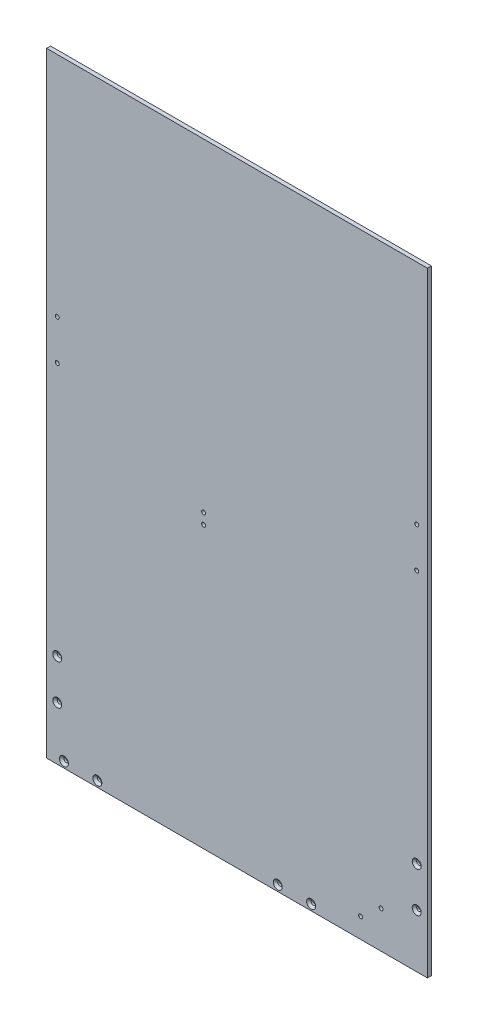
ISO-10303-21;
HEADER;
FILE_DESCRIPTION(('STEP AP214'),'2;1');
FILE_NAME('part.step','',(''),(''),'','','');
FILE_SCHEMA(('AUTOMOTIVE_DESIGN { 1 0 10303 214 1 1 1 1 }'));
ENDSEC;
DATA;
#1=APPLICATION_CONTEXT('core data for automotive mechanical design processes');
#2=APPLICATION_PROTOCOL_DEFINITION('international standard','automotive_design',2000,#1);
#3=PRODUCT_CONTEXT('',#1,'mechanical');
#4=PRODUCT('Part','Part','',(#3));
#5=PRODUCT_RELATED_PRODUCT_CATEGORY('part','',(#4));
#6=PRODUCT_DEFINITION_FORMATION('','',#4);
#7=PRODUCT_DEFINITION_CONTEXT('part definition',#1,'design');
#8=PRODUCT_DEFINITION('design','',#6,#7);
#9=PRODUCT_DEFINITION_SHAPE('','',#8);
#10=(LENGTH_UNIT() NAMED_UNIT(*) SI_UNIT(.MILLI.,.METRE.));
#11=(NAMED_UNIT(*) PLANE_ANGLE_UNIT() SI_UNIT($,.RADIAN.));
#12=(NAMED_UNIT(*) SI_UNIT($,.STERADIAN.) SOLID_ANGLE_UNIT());
#13=UNCERTAINTY_MEASURE_WITH_UNIT(LENGTH_MEASURE(1.E-05),#10,'distance_accuracy_value','');
#14=(GEOMETRIC_REPRESENTATION_CONTEXT(3) GLOBAL_UNCERTAINTY_ASSIGNED_CONTEXT((#13)) GLOBAL_UNIT_ASSIGNED_CONTEXT((#10,
#11,#12)) REPRESENTATION_CONTEXT('',''));
#15=CARTESIAN_POINT('',(0.,0.,0.));
#16=DIRECTION('',(0.,0.,1.));
#17=DIRECTION('',(1.,0.,0.));
#18=AXIS2_PLACEMENT_3D('',#15,#16,#17);
#19=CARTESIAN_POINT('',(142.5,230.,3.));
#20=DIRECTION('',(-1.,0.,0.));
#21=DIRECTION('',(0.,-1.,0.));
#22=AXIS2_PLACEMENT_3D('',#19,#20,#21);
#23=PLANE('',#22);
#24=DIRECTION('',(0.,1.,0.));
#25=VECTOR('',#24,1.);
#26=CARTESIAN_POINT('',(142.5,230.,0.));
#27=LINE('',#26,#25);
#28=CARTESIAN_POINT('',(142.5,-230.,0.));
#29=VERTEX_POINT('',#28);
#30=CARTESIAN_POINT('',(142.5,230.,0.));
#31=VERTEX_POINT('',#30);
#32=EDGE_CURVE('E109',#29,#31,#27,.T.);
#33=ORIENTED_EDGE('',*,*,#32,.T.);
#34=DIRECTION('',(0.,0.,-1.));
#35=VECTOR('',#34,1.);
#36=CARTESIAN_POINT('',(142.5,230.,3.));
#37=LINE('',#36,#35);
#38=CARTESIAN_POINT('',(142.5,230.,3.));
#39=VERTEX_POINT('',#38);
#40=EDGE_CURVE('E11',#39,#31,#37,.T.);
#41=ORIENTED_EDGE('',*,*,#40,.F.);
#42=DIRECTION('',(0.,1.,0.));
#43=VECTOR('',#42,1.);
#44=CARTESIAN_POINT('',(142.5,230.,3.));
#45=LINE('',#44,#43);
#46=CARTESIAN_POINT('',(142.5,-230.,3.));
#47=VERTEX_POINT('',#46);
#48=EDGE_CURVE('E93',#47,#39,#45,.T.);
#49=ORIENTED_EDGE('',*,*,#48,.F.);
#50=DIRECTION('',(0.,0.,-1.));
#51=VECTOR('',#50,1.);
#52=CARTESIAN_POINT('',(142.5,-230.,3.));
#53=LINE('',#52,#51);
#54=EDGE_CURVE('E105',#47,#29,#53,.T.);
#55=ORIENTED_EDGE('',*,*,#54,.T.);
#56=EDGE_LOOP('',(#33,#41,#49,#55));
#57=FACE_BOUND('',#56,.T.);
#58=ADVANCED_FACE('F41',(#57),#23,.F.);
#59=CARTESIAN_POINT('',(-142.5,230.,3.));
#60=DIRECTION('',(0.,-1.,0.));
#61=DIRECTION('',(0.,0.,-1.));
#62=AXIS2_PLACEMENT_3D('',#59,#60,#61);
#63=PLANE('',#62);
#64=DIRECTION('',(-1.,0.,0.));
#65=VECTOR('',#64,1.);
#66=CARTESIAN_POINT('',(-142.5,230.,0.));
#67=LINE('',#66,#65);
#68=CARTESIAN_POINT('',(-142.5,230.,0.));
#69=VERTEX_POINT('',#68);
#70=EDGE_CURVE('E98',#31,#69,#67,.T.);
#71=ORIENTED_EDGE('',*,*,#70,.T.);
#72=DIRECTION('',(0.,0.,-1.));
#73=VECTOR('',#72,1.);
#74=CARTESIAN_POINT('',(-142.5,230.,3.));
#75=LINE('',#74,#73);
#76=CARTESIAN_POINT('',(-142.5,230.,3.));
#77=VERTEX_POINT('',#76);
#78=EDGE_CURVE('E50',#77,#69,#75,.T.);
#79=ORIENTED_EDGE('',*,*,#78,.F.);
#80=DIRECTION('',(-1.,0.,0.));
#81=VECTOR('',#80,1.);
#82=CARTESIAN_POINT('',(-142.5,230.,3.));
#83=LINE('',#82,#81);
#84=EDGE_CURVE('E88',#39,#77,#83,.T.);
#85=ORIENTED_EDGE('',*,*,#84,.F.);
#86=ORIENTED_EDGE('',*,*,#40,.T.);
#87=EDGE_LOOP('',(#71,#79,#85,#86));
#88=FACE_BOUND('',#87,.T.);
#89=ADVANCED_FACE('F97',(#88),#63,.F.);
#90=CARTESIAN_POINT('',(-142.5,230.,3.));
#91=DIRECTION('',(1.,0.,0.));
#92=DIRECTION('',(0.,1.,0.));
#93=AXIS2_PLACEMENT_3D('',#90,#91,#92);
#94=PLANE('',#93);
#95=DIRECTION('',(0.,-1.,0.));
#96=VECTOR('',#95,1.);
#97=CARTESIAN_POINT('',(-142.5,230.,0.));
#98=LINE('',#97,#96);
#99=CARTESIAN_POINT('',(-142.5,-230.,0.));
#100=VERTEX_POINT('',#99);
#101=EDGE_CURVE('E75',#69,#100,#98,.T.);
#102=ORIENTED_EDGE('',*,*,#101,.T.);
#103=DIRECTION('',(0.,0.,-1.));
#104=VECTOR('',#103,1.);
#105=CARTESIAN_POINT('',(-142.5,-230.,3.));
#106=LINE('',#105,#104);
#107=CARTESIAN_POINT('',(-142.5,-230.,3.));
#108=VERTEX_POINT('',#107);
#109=EDGE_CURVE('E100',#108,#100,#106,.T.);
#110=ORIENTED_EDGE('',*,*,#109,.F.);
#111=DIRECTION('',(0.,-1.,0.));
#112=VECTOR('',#111,1.);
#113=CARTESIAN_POINT('',(-142.5,230.,3.));
#114=LINE('',#113,#112);
#115=EDGE_CURVE('E91',#77,#108,#114,.T.);
#116=ORIENTED_EDGE('',*,*,#115,.F.);
#117=ORIENTED_EDGE('',*,*,#78,.T.);
#118=EDGE_LOOP('',(#102,#110,#116,#117));
#119=FACE_BOUND('',#118,.T.);
#120=ADVANCED_FACE('F101',(#119),#94,.F.);
#121=CARTESIAN_POINT('',(-142.5,-230.,3.));
#122=DIRECTION('',(0.,1.,0.));
#123=DIRECTION('',(0.,0.,1.));
#124=AXIS2_PLACEMENT_3D('',#121,#122,#123);
#125=PLANE('',#124);
#126=DIRECTION('',(1.,0.,0.));
#127=VECTOR('',#126,1.);
#128=CARTESIAN_POINT('',(-142.5,-230.,0.));
#129=LINE('',#128,#127);
#130=EDGE_CURVE('E81',#100,#29,#129,.T.);
#131=ORIENTED_EDGE('',*,*,#130,.T.);
#132=ORIENTED_EDGE('',*,*,#54,.F.);
#133=DIRECTION('',(1.,0.,0.));
#134=VECTOR('',#133,1.);
#135=CARTESIAN_POINT('',(-142.5,-230.,3.));
#136=LINE('',#135,#134);
#137=EDGE_CURVE('E58',#108,#47,#136,.T.);
#138=ORIENTED_EDGE('',*,*,#137,.F.);
#139=ORIENTED_EDGE('',*,*,#109,.T.);
#140=EDGE_LOOP('',(#131,#132,#138,#139));
#141=FACE_BOUND('',#140,.T.);
#142=ADVANCED_FACE('F123',(#141),#125,.F.);
#143=CARTESIAN_POINT('',(0.,0.,3.));
#144=DIRECTION('',(0.,0.,1.));
#145=DIRECTION('',(1.,0.,0.));
#146=AXIS2_PLACEMENT_3D('',#143,#144,#145);
#147=PLANE('',#146);
#148=CARTESIAN_POINT('',(-134.5,-160.,3.));
#149=DIRECTION('',(0.,0.,1.));
#150=DIRECTION('',(1.,0.,0.));
#151=AXIS2_PLACEMENT_3D('',#148,#149,#150);
#152=CIRCLE('',#151,3.36);
#153=CARTESIAN_POINT('',(-131.14,-160.,3.));
#154=VERTEX_POINT('',#153);
#155=EDGE_CURVE('E285',#154,#154,#152,.T.);
#156=ORIENTED_EDGE('',*,*,#155,.F.);
#157=EDGE_LOOP('',(#156));
#158=FACE_BOUND('',#157,.T.);
#159=CARTESIAN_POINT('',(-134.5,-190.,3.));
#160=DIRECTION('',(0.,0.,1.));
#161=DIRECTION('',(1.,0.,0.));
#162=AXIS2_PLACEMENT_3D('',#159,#160,#161);
#163=CIRCLE('',#162,3.36);
#164=CARTESIAN_POINT('',(-131.14,-190.,3.));
#165=VERTEX_POINT('',#164);
#166=EDGE_CURVE('E273',#165,#165,#163,.T.);
#167=ORIENTED_EDGE('',*,*,#166,.F.);
#168=EDGE_LOOP('',(#167));
#169=FACE_BOUND('',#168,.T.);
#170=CARTESIAN_POINT('',(134.5,-160.,3.));
#171=DIRECTION('',(0.,0.,1.));
#172=DIRECTION('',(1.,0.,0.));
#173=AXIS2_PLACEMENT_3D('',#170,#171,#172);
#174=CIRCLE('',#173,3.36);
#175=CARTESIAN_POINT('',(137.86,-160.,3.));
#176=VERTEX_POINT('',#175);
#177=EDGE_CURVE('E261',#176,#176,#174,.T.);
#178=ORIENTED_EDGE('',*,*,#177,.F.);
#179=EDGE_LOOP('',(#178));
#180=FACE_BOUND('',#179,.T.);
#181=CARTESIAN_POINT('',(134.5,-190.,3.));
#182=DIRECTION('',(0.,0.,1.));
#183=DIRECTION('',(1.,0.,0.));
#184=AXIS2_PLACEMENT_3D('',#181,#182,#183);
#185=CIRCLE('',#184,3.36);
#186=CARTESIAN_POINT('',(137.86,-190.,3.));
#187=VERTEX_POINT('',#186);
#188=EDGE_CURVE('E249',#187,#187,#185,.T.);
#189=ORIENTED_EDGE('',*,*,#188,.F.);
#190=EDGE_LOOP('',(#189));
#191=FACE_BOUND('',#190,.T.);
#192=CARTESIAN_POINT('',(-129.5,-225.5,3.));
#193=DIRECTION('',(0.,0.,1.));
#194=DIRECTION('',(1.,0.,0.));
#195=AXIS2_PLACEMENT_3D('',#192,#193,#194);
#196=CIRCLE('',#195,3.36);
#197=CARTESIAN_POINT('',(-126.14,-225.5,3.));
#198=VERTEX_POINT('',#197);
#199=EDGE_CURVE('E237',#198,#198,#196,.T.);
#200=ORIENTED_EDGE('',*,*,#199,.F.);
#201=EDGE_LOOP('',(#200));
#202=FACE_BOUND('',#201,.T.);
#203=CARTESIAN_POINT('',(-104.5,-225.5,3.));
#204=DIRECTION('',(0.,0.,1.));
#205=DIRECTION('',(1.,0.,0.));
#206=AXIS2_PLACEMENT_3D('',#203,#204,#205);
#207=CIRCLE('',#206,3.36);
#208=CARTESIAN_POINT('',(-101.14,-225.5,3.));
#209=VERTEX_POINT('',#208);
#210=EDGE_CURVE('E225',#209,#209,#207,.T.);
#211=ORIENTED_EDGE('',*,*,#210,.F.);
#212=EDGE_LOOP('',(#211));
#213=FACE_BOUND('',#212,.T.);
#214=CARTESIAN_POINT('',(30.5,-225.5,3.));
#215=DIRECTION('',(0.,0.,1.));
#216=DIRECTION('',(1.,0.,0.));
#217=AXIS2_PLACEMENT_3D('',#214,#215,#216);
#218=CIRCLE('',#217,3.36);
#219=CARTESIAN_POINT('',(33.86,-225.5,3.));
#220=VERTEX_POINT('',#219);
#221=EDGE_CURVE('E213',#220,#220,#218,.T.);
#222=ORIENTED_EDGE('',*,*,#221,.F.);
#223=EDGE_LOOP('',(#222));
#224=FACE_BOUND('',#223,.T.);
#225=CARTESIAN_POINT('',(55.5,-225.5,3.));
#226=DIRECTION('',(0.,0.,1.));
#227=DIRECTION('',(1.,0.,0.));
#228=AXIS2_PLACEMENT_3D('',#225,#226,#227);
#229=CIRCLE('',#228,3.36);
#230=CARTESIAN_POINT('',(58.86,-225.5,3.));
#231=VERTEX_POINT('',#230);
#232=EDGE_CURVE('E201',#231,#231,#229,.T.);
#233=ORIENTED_EDGE('',*,*,#232,.F.);
#234=EDGE_LOOP('',(#233));
#235=FACE_BOUND('',#234,.T.);
#236=CARTESIAN_POINT('',(107.82088886238,-202.144247806269,3.));
#237=DIRECTION('',(0.,0.,-1.));
#238=DIRECTION('',(1.,0.,0.));
#239=AXIS2_PLACEMENT_3D('',#236,#237,#238);
#240=CIRCLE('',#239,1.49999999999997);
#241=CARTESIAN_POINT('',(109.320888862379,-202.144247806269,3.));
#242=VERTEX_POINT('',#241);
#243=EDGE_CURVE('E167',#242,#242,#240,.T.);
#244=ORIENTED_EDGE('',*,*,#243,.T.);
#245=EDGE_LOOP('',(#244));
#246=FACE_BOUND('',#245,.T.);
#247=CARTESIAN_POINT('',(92.5,-215.,3.));
#248=DIRECTION('',(0.,0.,-1.));
#249=DIRECTION('',(1.,0.,0.));
#250=AXIS2_PLACEMENT_3D('',#247,#248,#249);
#251=CIRCLE('',#250,1.5);
#252=CARTESIAN_POINT('',(94.,-215.,3.));
#253=VERTEX_POINT('',#252);
#254=EDGE_CURVE('E182',#253,#253,#251,.T.);
#255=ORIENTED_EDGE('',*,*,#254,.T.);
#256=EDGE_LOOP('',(#255));
#257=FACE_BOUND('',#256,.T.);
#258=CARTESIAN_POINT('',(-25.,-19.9999999999999,3.));
#259=DIRECTION('',(0.,0.,-1.));
#260=DIRECTION('',(-1.,0.,0.));
#261=AXIS2_PLACEMENT_3D('',#258,#259,#260);
#262=CIRCLE('',#261,1.5);
#263=CARTESIAN_POINT('',(-26.5,-19.9999999999999,3.));
#264=VERTEX_POINT('',#263);
#265=EDGE_CURVE('E158',#264,#264,#262,.T.);
#266=ORIENTED_EDGE('',*,*,#265,.T.);
#267=EDGE_LOOP('',(#266));
#268=FACE_BOUND('',#267,.T.);
#269=CARTESIAN_POINT('',(-25.,-11.9999999999999,3.));
#270=DIRECTION('',(0.,0.,-1.));
#271=DIRECTION('',(-1.,0.,0.));
#272=AXIS2_PLACEMENT_3D('',#269,#270,#271);
#273=CIRCLE('',#272,1.5);
#274=CARTESIAN_POINT('',(-26.5,-11.9999999999999,3.));
#275=VERTEX_POINT('',#274);
#276=EDGE_CURVE('E166',#275,#275,#273,.T.);
#277=ORIENTED_EDGE('',*,*,#276,.T.);
#278=EDGE_LOOP('',(#277));
#279=FACE_BOUND('',#278,.T.);
#280=CARTESIAN_POINT('',(-134.5,30.0000000000001,3.));
#281=DIRECTION('',(0.,0.,1.));
#282=DIRECTION('',(1.,0.,0.));
#283=AXIS2_PLACEMENT_3D('',#280,#281,#282);
#284=CIRCLE('',#283,1.5);
#285=CARTESIAN_POINT('',(-133.,30.0000000000001,3.));
#286=VERTEX_POINT('',#285);
#287=EDGE_CURVE('E130',#286,#286,#284,.T.);
#288=ORIENTED_EDGE('',*,*,#287,.F.);
#289=EDGE_LOOP('',(#288));
#290=FACE_BOUND('',#289,.T.);
#291=CARTESIAN_POINT('',(134.5,60.0000000000001,3.));
#292=DIRECTION('',(0.,0.,1.));
#293=DIRECTION('',(-1.,0.,0.));
#294=AXIS2_PLACEMENT_3D('',#291,#292,#293);
#295=CIRCLE('',#294,1.5);
#296=CARTESIAN_POINT('',(133.,60.0000000000001,3.));
#297=VERTEX_POINT('',#296);
#298=EDGE_CURVE('E154',#297,#297,#295,.T.);
#299=ORIENTED_EDGE('',*,*,#298,.F.);
#300=EDGE_LOOP('',(#299));
#301=FACE_BOUND('',#300,.T.);
#302=CARTESIAN_POINT('',(-134.5,60.0000000000001,3.));
#303=DIRECTION('',(0.,0.,1.));
#304=DIRECTION('',(1.,0.,0.));
#305=AXIS2_PLACEMENT_3D('',#302,#303,#304);
#306=CIRCLE('',#305,1.5);
#307=CARTESIAN_POINT('',(-133.,60.0000000000001,3.));
#308=VERTEX_POINT('',#307);
#309=EDGE_CURVE('E138',#308,#308,#306,.T.);
#310=ORIENTED_EDGE('',*,*,#309,.F.);
#311=EDGE_LOOP('',(#310));
#312=FACE_BOUND('',#311,.T.);
#313=CARTESIAN_POINT('',(134.5,30.0000000000001,3.));
#314=DIRECTION('',(0.,0.,1.));
#315=DIRECTION('',(-1.,0.,0.));
#316=AXIS2_PLACEMENT_3D('',#313,#314,#315);
#317=CIRCLE('',#316,1.5);
#318=CARTESIAN_POINT('',(133.,30.0000000000001,3.));
#319=VERTEX_POINT('',#318);
#320=EDGE_CURVE('E147',#319,#319,#317,.T.);
#321=ORIENTED_EDGE('',*,*,#320,.F.);
#322=EDGE_LOOP('',(#321));
#323=FACE_BOUND('',#322,.T.);
#324=ORIENTED_EDGE('',*,*,#48,.T.);
#325=ORIENTED_EDGE('',*,*,#84,.T.);
#326=ORIENTED_EDGE('',*,*,#115,.T.);
#327=ORIENTED_EDGE('',*,*,#137,.T.);
#328=EDGE_LOOP('',(#324,#325,#326,#327));
#329=FACE_BOUND('',#328,.T.);
#330=ADVANCED_FACE('F89',(#158,#169,#180,#191,#202,#213,#224,#235,#246,#257,#268,#279,#290,#301,
#312,#323,#329),#147,.T.);
#331=CARTESIAN_POINT('',(0.,0.,0.));
#332=DIRECTION('',(0.,0.,1.));
#333=DIRECTION('',(1.,0.,0.));
#334=AXIS2_PLACEMENT_3D('',#331,#332,#333);
#335=PLANE('',#334);
#336=CARTESIAN_POINT('',(-134.5,-160.,0.));
#337=DIRECTION('',(0.,0.,1.));
#338=DIRECTION('',(1.,0.,0.));
#339=AXIS2_PLACEMENT_3D('',#336,#337,#338);
#340=CIRCLE('',#339,1.69999999999998);
#341=CARTESIAN_POINT('',(-132.8,-160.,0.));
#342=VERTEX_POINT('',#341);
#343=EDGE_CURVE('E277',#342,#342,#340,.T.);
#344=ORIENTED_EDGE('',*,*,#343,.T.);
#345=EDGE_LOOP('',(#344));
#346=FACE_BOUND('',#345,.T.);
#347=CARTESIAN_POINT('',(-134.5,-190.,0.));
#348=DIRECTION('',(0.,0.,1.));
#349=DIRECTION('',(1.,0.,0.));
#350=AXIS2_PLACEMENT_3D('',#347,#348,#349);
#351=CIRCLE('',#350,1.69999999999998);
#352=CARTESIAN_POINT('',(-132.8,-190.,0.));
#353=VERTEX_POINT('',#352);
#354=EDGE_CURVE('E265',#353,#353,#351,.T.);
#355=ORIENTED_EDGE('',*,*,#354,.T.);
#356=EDGE_LOOP('',(#355));
#357=FACE_BOUND('',#356,.T.);
#358=CARTESIAN_POINT('',(134.5,-160.,0.));
#359=DIRECTION('',(0.,0.,1.));
#360=DIRECTION('',(1.,0.,0.));
#361=AXIS2_PLACEMENT_3D('',#358,#359,#360);
#362=CIRCLE('',#361,1.69999999999998);
#363=CARTESIAN_POINT('',(136.2,-160.,0.));
#364=VERTEX_POINT('',#363);
#365=EDGE_CURVE('E253',#364,#364,#362,.T.);
#366=ORIENTED_EDGE('',*,*,#365,.T.);
#367=EDGE_LOOP('',(#366));
#368=FACE_BOUND('',#367,.T.);
#369=CARTESIAN_POINT('',(134.5,-190.,0.));
#370=DIRECTION('',(0.,0.,1.));
#371=DIRECTION('',(1.,0.,0.));
#372=AXIS2_PLACEMENT_3D('',#369,#370,#371);
#373=CIRCLE('',#372,1.69999999999998);
#374=CARTESIAN_POINT('',(136.2,-190.,0.));
#375=VERTEX_POINT('',#374);
#376=EDGE_CURVE('E241',#375,#375,#373,.T.);
#377=ORIENTED_EDGE('',*,*,#376,.T.);
#378=EDGE_LOOP('',(#377));
#379=FACE_BOUND('',#378,.T.);
#380=CARTESIAN_POINT('',(-129.5,-225.5,0.));
#381=DIRECTION('',(0.,0.,1.));
#382=DIRECTION('',(1.,0.,0.));
#383=AXIS2_PLACEMENT_3D('',#380,#381,#382);
#384=CIRCLE('',#383,1.69999999999998);
#385=CARTESIAN_POINT('',(-127.8,-225.5,0.));
#386=VERTEX_POINT('',#385);
#387=EDGE_CURVE('E229',#386,#386,#384,.T.);
#388=ORIENTED_EDGE('',*,*,#387,.T.);
#389=EDGE_LOOP('',(#388));
#390=FACE_BOUND('',#389,.T.);
#391=CARTESIAN_POINT('',(-104.5,-225.5,0.));
#392=DIRECTION('',(0.,0.,1.));
#393=DIRECTION('',(1.,0.,0.));
#394=AXIS2_PLACEMENT_3D('',#391,#392,#393);
#395=CIRCLE('',#394,1.69999999999999);
#396=CARTESIAN_POINT('',(-102.8,-225.5,0.));
#397=VERTEX_POINT('',#396);
#398=EDGE_CURVE('E217',#397,#397,#395,.T.);
#399=ORIENTED_EDGE('',*,*,#398,.T.);
#400=EDGE_LOOP('',(#399));
#401=FACE_BOUND('',#400,.T.);
#402=CARTESIAN_POINT('',(30.5,-225.5,0.));
#403=DIRECTION('',(0.,0.,1.));
#404=DIRECTION('',(1.,0.,0.));
#405=AXIS2_PLACEMENT_3D('',#402,#403,#404);
#406=CIRCLE('',#405,1.69999999999999);
#407=CARTESIAN_POINT('',(32.2,-225.5,0.));
#408=VERTEX_POINT('',#407);
#409=EDGE_CURVE('E205',#408,#408,#406,.T.);
#410=ORIENTED_EDGE('',*,*,#409,.T.);
#411=EDGE_LOOP('',(#410));
#412=FACE_BOUND('',#411,.T.);
#413=CARTESIAN_POINT('',(55.5,-225.5,0.));
#414=DIRECTION('',(0.,0.,1.));
#415=DIRECTION('',(1.,0.,0.));
#416=AXIS2_PLACEMENT_3D('',#413,#414,#415);
#417=CIRCLE('',#416,1.69999999999999);
#418=CARTESIAN_POINT('',(57.2,-225.5,0.));
#419=VERTEX_POINT('',#418);
#420=EDGE_CURVE('E183',#419,#419,#417,.T.);
#421=ORIENTED_EDGE('',*,*,#420,.T.);
#422=EDGE_LOOP('',(#421));
#423=FACE_BOUND('',#422,.T.);
#424=CARTESIAN_POINT('',(107.82088886238,-202.144247806269,0.));
#425=DIRECTION('',(0.,0.,-1.));
#426=DIRECTION('',(1.,0.,0.));
#427=AXIS2_PLACEMENT_3D('',#424,#425,#426);
#428=CIRCLE('',#427,1.49999999999997);
#429=CARTESIAN_POINT('',(109.320888862379,-202.144247806269,0.));
#430=VERTEX_POINT('',#429);
#431=EDGE_CURVE('E187',#430,#430,#428,.T.);
#432=ORIENTED_EDGE('',*,*,#431,.F.);
#433=EDGE_LOOP('',(#432));
#434=FACE_BOUND('',#433,.T.);
#435=CARTESIAN_POINT('',(92.5,-215.,0.));
#436=DIRECTION('',(0.,0.,-1.));
#437=DIRECTION('',(1.,0.,0.));
#438=AXIS2_PLACEMENT_3D('',#435,#436,#437);
#439=CIRCLE('',#438,1.5);
#440=CARTESIAN_POINT('',(94.,-215.,0.));
#441=VERTEX_POINT('',#440);
#442=EDGE_CURVE('E178',#441,#441,#439,.T.);
#443=ORIENTED_EDGE('',*,*,#442,.F.);
#444=EDGE_LOOP('',(#443));
#445=FACE_BOUND('',#444,.T.);
#446=CARTESIAN_POINT('',(-25.,-19.9999999999999,0.));
#447=DIRECTION('',(0.,0.,-1.));
#448=DIRECTION('',(-1.,0.,0.));
#449=AXIS2_PLACEMENT_3D('',#446,#447,#448);
#450=CIRCLE('',#449,1.5);
#451=CARTESIAN_POINT('',(-26.5,-19.9999999999999,0.));
#452=VERTEX_POINT('',#451);
#453=EDGE_CURVE('E171',#452,#452,#450,.T.);
#454=ORIENTED_EDGE('',*,*,#453,.F.);
#455=EDGE_LOOP('',(#454));
#456=FACE_BOUND('',#455,.T.);
#457=CARTESIAN_POINT('',(-25.,-11.9999999999999,0.));
#458=DIRECTION('',(0.,0.,-1.));
#459=DIRECTION('',(-1.,0.,0.));
#460=AXIS2_PLACEMENT_3D('',#457,#458,#459);
#461=CIRCLE('',#460,1.5);
#462=CARTESIAN_POINT('',(-26.5,-11.9999999999999,0.));
#463=VERTEX_POINT('',#462);
#464=EDGE_CURVE('E162',#463,#463,#461,.T.);
#465=ORIENTED_EDGE('',*,*,#464,.F.);
#466=EDGE_LOOP('',(#465));
#467=FACE_BOUND('',#466,.T.);
#468=CARTESIAN_POINT('',(-134.5,30.0000000000001,0.));
#469=DIRECTION('',(0.,0.,1.));
#470=DIRECTION('',(1.,0.,0.));
#471=AXIS2_PLACEMENT_3D('',#468,#469,#470);
#472=CIRCLE('',#471,1.5);
#473=CARTESIAN_POINT('',(-133.,30.0000000000001,0.));
#474=VERTEX_POINT('',#473);
#475=EDGE_CURVE('E113',#474,#474,#472,.T.);
#476=ORIENTED_EDGE('',*,*,#475,.T.);
#477=EDGE_LOOP('',(#476));
#478=FACE_BOUND('',#477,.T.);
#479=CARTESIAN_POINT('',(134.5,60.0000000000001,0.));
#480=DIRECTION('',(0.,0.,1.));
#481=DIRECTION('',(-1.,0.,0.));
#482=AXIS2_PLACEMENT_3D('',#479,#480,#481);
#483=CIRCLE('',#482,1.5);
#484=CARTESIAN_POINT('',(133.,60.0000000000001,0.));
#485=VERTEX_POINT('',#484);
#486=EDGE_CURVE('E143',#485,#485,#483,.T.);
#487=ORIENTED_EDGE('',*,*,#486,.T.);
#488=EDGE_LOOP('',(#487));
#489=FACE_BOUND('',#488,.T.);
#490=CARTESIAN_POINT('',(-134.5,60.0000000000001,0.));
#491=DIRECTION('',(0.,0.,1.));
#492=DIRECTION('',(1.,0.,0.));
#493=AXIS2_PLACEMENT_3D('',#490,#491,#492);
#494=CIRCLE('',#493,1.5);
#495=CARTESIAN_POINT('',(-133.,60.0000000000001,0.));
#496=VERTEX_POINT('',#495);
#497=EDGE_CURVE('E142',#496,#496,#494,.T.);
#498=ORIENTED_EDGE('',*,*,#497,.T.);
#499=EDGE_LOOP('',(#498));
#500=FACE_BOUND('',#499,.T.);
#501=CARTESIAN_POINT('',(134.5,30.0000000000001,0.));
#502=DIRECTION('',(0.,0.,1.));
#503=DIRECTION('',(-1.,0.,0.));
#504=AXIS2_PLACEMENT_3D('',#501,#502,#503);
#505=CIRCLE('',#504,1.5);
#506=CARTESIAN_POINT('',(133.,30.0000000000001,0.));
#507=VERTEX_POINT('',#506);
#508=EDGE_CURVE('E134',#507,#507,#505,.T.);
#509=ORIENTED_EDGE('',*,*,#508,.T.);
#510=EDGE_LOOP('',(#509));
#511=FACE_BOUND('',#510,.T.);
#512=ORIENTED_EDGE('',*,*,#32,.F.);
#513=ORIENTED_EDGE('',*,*,#130,.F.);
#514=ORIENTED_EDGE('',*,*,#101,.F.);
#515=ORIENTED_EDGE('',*,*,#70,.F.);
#516=EDGE_LOOP('',(#512,#513,#514,#515));
#517=FACE_BOUND('',#516,.T.);
#518=ADVANCED_FACE('F126',(#346,#357,#368,#379,#390,#401,#412,#423,#434,#445,#456,#467,#478,
#489,#500,#511,#517),#335,.F.);
#519=CARTESIAN_POINT('',(134.5,30.0000000000001,0.));
#520=DIRECTION('',(0.,0.,1.));
#521=DIRECTION('',(1.,0.,0.));
#522=AXIS2_PLACEMENT_3D('',#519,#520,#521);
#523=CYLINDRICAL_SURFACE('',#522,1.5);
#524=ORIENTED_EDGE('',*,*,#508,.F.);
#525=EDGE_LOOP('',(#524));
#526=FACE_BOUND('',#525,.T.);
#527=ORIENTED_EDGE('',*,*,#320,.T.);
#528=EDGE_LOOP('',(#527));
#529=FACE_BOUND('',#528,.T.);
#530=ADVANCED_FACE('F325',(#526,#529),#523,.F.);
#531=CARTESIAN_POINT('',(-134.5,60.0000000000001,0.));
#532=DIRECTION('',(0.,0.,1.));
#533=DIRECTION('',(1.,0.,0.));
#534=AXIS2_PLACEMENT_3D('',#531,#532,#533);
#535=CYLINDRICAL_SURFACE('',#534,1.5);
#536=ORIENTED_EDGE('',*,*,#497,.F.);
#537=EDGE_LOOP('',(#536));
#538=FACE_BOUND('',#537,.T.);
#539=ORIENTED_EDGE('',*,*,#309,.T.);
#540=EDGE_LOOP('',(#539));
#541=FACE_BOUND('',#540,.T.);
#542=ADVANCED_FACE('F327',(#538,#541),#535,.F.);
#543=CARTESIAN_POINT('',(134.5,60.0000000000001,0.));
#544=DIRECTION('',(0.,0.,1.));
#545=DIRECTION('',(1.,0.,0.));
#546=AXIS2_PLACEMENT_3D('',#543,#544,#545);
#547=CYLINDRICAL_SURFACE('',#546,1.5);
#548=ORIENTED_EDGE('',*,*,#486,.F.);
#549=EDGE_LOOP('',(#548));
#550=FACE_BOUND('',#549,.T.);
#551=ORIENTED_EDGE('',*,*,#298,.T.);
#552=EDGE_LOOP('',(#551));
#553=FACE_BOUND('',#552,.T.);
#554=ADVANCED_FACE('F334',(#550,#553),#547,.F.);
#555=CARTESIAN_POINT('',(-134.5,30.0000000000001,0.));
#556=DIRECTION('',(0.,0.,1.));
#557=DIRECTION('',(1.,0.,0.));
#558=AXIS2_PLACEMENT_3D('',#555,#556,#557);
#559=CYLINDRICAL_SURFACE('',#558,1.5);
#560=ORIENTED_EDGE('',*,*,#475,.F.);
#561=EDGE_LOOP('',(#560));
#562=FACE_BOUND('',#561,.T.);
#563=ORIENTED_EDGE('',*,*,#287,.T.);
#564=EDGE_LOOP('',(#563));
#565=FACE_BOUND('',#564,.T.);
#566=ADVANCED_FACE('F352',(#562,#565),#559,.F.);
#567=CARTESIAN_POINT('',(-25.,-11.9999999999999,3.));
#568=DIRECTION('',(0.,0.,-1.));
#569=DIRECTION('',(-1.,0.,0.));
#570=AXIS2_PLACEMENT_3D('',#567,#568,#569);
#571=CYLINDRICAL_SURFACE('',#570,1.5);
#572=ORIENTED_EDGE('',*,*,#276,.F.);
#573=EDGE_LOOP('',(#572));
#574=FACE_BOUND('',#573,.T.);
#575=ORIENTED_EDGE('',*,*,#464,.T.);
#576=EDGE_LOOP('',(#575));
#577=FACE_BOUND('',#576,.T.);
#578=ADVANCED_FACE('F354',(#574,#577),#571,.F.);
#579=CARTESIAN_POINT('',(-25.,-19.9999999999999,3.));
#580=DIRECTION('',(0.,0.,-1.));
#581=DIRECTION('',(-1.,0.,0.));
#582=AXIS2_PLACEMENT_3D('',#579,#580,#581);
#583=CYLINDRICAL_SURFACE('',#582,1.5);
#584=ORIENTED_EDGE('',*,*,#265,.F.);
#585=EDGE_LOOP('',(#584));
#586=FACE_BOUND('',#585,.T.);
#587=ORIENTED_EDGE('',*,*,#453,.T.);
#588=EDGE_LOOP('',(#587));
#589=FACE_BOUND('',#588,.T.);
#590=ADVANCED_FACE('F360',(#586,#589),#583,.F.);
#591=CARTESIAN_POINT('',(92.5,-215.,3.));
#592=DIRECTION('',(0.,0.,-1.));
#593=DIRECTION('',(-1.,0.,0.));
#594=AXIS2_PLACEMENT_3D('',#591,#592,#593);
#595=CYLINDRICAL_SURFACE('',#594,1.5);
#596=ORIENTED_EDGE('',*,*,#254,.F.);
#597=EDGE_LOOP('',(#596));
#598=FACE_BOUND('',#597,.T.);
#599=ORIENTED_EDGE('',*,*,#442,.T.);
#600=EDGE_LOOP('',(#599));
#601=FACE_BOUND('',#600,.T.);
#602=ADVANCED_FACE('F379',(#598,#601),#595,.F.);
#603=CARTESIAN_POINT('',(107.82088886238,-202.144247806269,3.));
#604=DIRECTION('',(0.,0.,-1.));
#605=DIRECTION('',(-1.,0.,0.));
#606=AXIS2_PLACEMENT_3D('',#603,#604,#605);
#607=CYLINDRICAL_SURFACE('',#606,1.49999999999997);
#608=ORIENTED_EDGE('',*,*,#243,.F.);
#609=EDGE_LOOP('',(#608));
#610=FACE_BOUND('',#609,.T.);
#611=ORIENTED_EDGE('',*,*,#431,.T.);
#612=EDGE_LOOP('',(#611));
#613=FACE_BOUND('',#612,.T.);
#614=ADVANCED_FACE('F383',(#610,#613),#607,.F.);
#615=CARTESIAN_POINT('',(55.5,-225.5,3.));
#616=DIRECTION('',(0.,0.,1.));
#617=DIRECTION('',(1.,0.,0.));
#618=AXIS2_PLACEMENT_3D('',#615,#616,#617);
#619=CYLINDRICAL_SURFACE('',#618,1.69999999999999);
#620=ORIENTED_EDGE('',*,*,#420,.F.);
#621=EDGE_LOOP('',(#620));
#622=FACE_BOUND('',#621,.T.);
#623=CARTESIAN_POINT('',(55.5,-225.5,1.34));
#624=DIRECTION('',(0.,0.,1.));
#625=DIRECTION('',(1.,0.,0.));
#626=AXIS2_PLACEMENT_3D('',#623,#624,#625);
#627=CIRCLE('',#626,1.7);
#628=CARTESIAN_POINT('',(57.2,-225.5,1.34));
#629=VERTEX_POINT('',#628);
#630=EDGE_CURVE('E197',#629,#629,#627,.T.);
#631=ORIENTED_EDGE('',*,*,#630,.T.);
#632=EDGE_LOOP('',(#631));
#633=FACE_BOUND('',#632,.T.);
#634=ADVANCED_FACE('F387',(#622,#633),#619,.F.);
#635=CARTESIAN_POINT('',(55.5,-225.5,3.));
#636=DIRECTION('',(0.,0.,1.));
#637=DIRECTION('',(1.,0.,0.));
#638=AXIS2_PLACEMENT_3D('',#635,#636,#637);
#639=CONICAL_SURFACE('',#638,3.36,0.785398163397448);
#640=ORIENTED_EDGE('',*,*,#630,.F.);
#641=EDGE_LOOP('',(#640));
#642=FACE_BOUND('',#641,.T.);
#643=ORIENTED_EDGE('',*,*,#232,.T.);
#644=EDGE_LOOP('',(#643));
#645=FACE_BOUND('',#644,.T.);
#646=ADVANCED_FACE('F391',(#642,#645),#639,.F.);
#647=CARTESIAN_POINT('',(30.5,-225.5,3.));
#648=DIRECTION('',(0.,0.,1.));
#649=DIRECTION('',(1.,0.,0.));
#650=AXIS2_PLACEMENT_3D('',#647,#648,#649);
#651=CYLINDRICAL_SURFACE('',#650,1.69999999999999);
#652=ORIENTED_EDGE('',*,*,#409,.F.);
#653=EDGE_LOOP('',(#652));
#654=FACE_BOUND('',#653,.T.);
#655=CARTESIAN_POINT('',(30.5,-225.5,1.34));
#656=DIRECTION('',(0.,0.,1.));
#657=DIRECTION('',(1.,0.,0.));
#658=AXIS2_PLACEMENT_3D('',#655,#656,#657);
#659=CIRCLE('',#658,1.7);
#660=CARTESIAN_POINT('',(32.2,-225.5,1.34));
#661=VERTEX_POINT('',#660);
#662=EDGE_CURVE('E209',#661,#661,#659,.T.);
#663=ORIENTED_EDGE('',*,*,#662,.T.);
#664=EDGE_LOOP('',(#663));
#665=FACE_BOUND('',#664,.T.);
#666=ADVANCED_FACE('F395',(#654,#665),#651,.F.);
#667=CARTESIAN_POINT('',(30.5,-225.5,3.));
#668=DIRECTION('',(0.,0.,1.));
#669=DIRECTION('',(1.,0.,0.));
#670=AXIS2_PLACEMENT_3D('',#667,#668,#669);
#671=CONICAL_SURFACE('',#670,3.36,0.785398163397448);
#672=ORIENTED_EDGE('',*,*,#662,.F.);
#673=EDGE_LOOP('',(#672));
#674=FACE_BOUND('',#673,.T.);
#675=ORIENTED_EDGE('',*,*,#221,.T.);
#676=EDGE_LOOP('',(#675));
#677=FACE_BOUND('',#676,.T.);
#678=ADVANCED_FACE('F399',(#674,#677),#671,.F.);
#679=CARTESIAN_POINT('',(-104.5,-225.5,3.));
#680=DIRECTION('',(0.,0.,1.));
#681=DIRECTION('',(1.,0.,0.));
#682=AXIS2_PLACEMENT_3D('',#679,#680,#681);
#683=CYLINDRICAL_SURFACE('',#682,1.69999999999999);
#684=ORIENTED_EDGE('',*,*,#398,.F.);
#685=EDGE_LOOP('',(#684));
#686=FACE_BOUND('',#685,.T.);
#687=CARTESIAN_POINT('',(-104.5,-225.5,1.34));
#688=DIRECTION('',(0.,0.,1.));
#689=DIRECTION('',(1.,0.,0.));
#690=AXIS2_PLACEMENT_3D('',#687,#688,#689);
#691=CIRCLE('',#690,1.69999999999999);
#692=CARTESIAN_POINT('',(-102.8,-225.5,1.34));
#693=VERTEX_POINT('',#692);
#694=EDGE_CURVE('E221',#693,#693,#691,.T.);
#695=ORIENTED_EDGE('',*,*,#694,.T.);
#696=EDGE_LOOP('',(#695));
#697=FACE_BOUND('',#696,.T.);
#698=ADVANCED_FACE('F403',(#686,#697),#683,.F.);
#699=CARTESIAN_POINT('',(-104.5,-225.5,3.));
#700=DIRECTION('',(0.,0.,1.));
#701=DIRECTION('',(1.,0.,0.));
#702=AXIS2_PLACEMENT_3D('',#699,#700,#701);
#703=CONICAL_SURFACE('',#702,3.36,0.78539816339745);
#704=ORIENTED_EDGE('',*,*,#694,.F.);
#705=EDGE_LOOP('',(#704));
#706=FACE_BOUND('',#705,.T.);
#707=ORIENTED_EDGE('',*,*,#210,.T.);
#708=EDGE_LOOP('',(#707));
#709=FACE_BOUND('',#708,.T.);
#710=ADVANCED_FACE('F407',(#706,#709),#703,.F.);
#711=CARTESIAN_POINT('',(-129.5,-225.5,3.));
#712=DIRECTION('',(0.,0.,1.));
#713=DIRECTION('',(1.,0.,0.));
#714=AXIS2_PLACEMENT_3D('',#711,#712,#713);
#715=CYLINDRICAL_SURFACE('',#714,1.69999999999999);
#716=ORIENTED_EDGE('',*,*,#387,.F.);
#717=EDGE_LOOP('',(#716));
#718=FACE_BOUND('',#717,.T.);
#719=CARTESIAN_POINT('',(-129.5,-225.5,1.34));
#720=DIRECTION('',(0.,0.,1.));
#721=DIRECTION('',(1.,0.,0.));
#722=AXIS2_PLACEMENT_3D('',#719,#720,#721);
#723=CIRCLE('',#722,1.70000000000001);
#724=CARTESIAN_POINT('',(-127.8,-225.5,1.34));
#725=VERTEX_POINT('',#724);
#726=EDGE_CURVE('E233',#725,#725,#723,.T.);
#727=ORIENTED_EDGE('',*,*,#726,.T.);
#728=EDGE_LOOP('',(#727));
#729=FACE_BOUND('',#728,.T.);
#730=ADVANCED_FACE('F411',(#718,#729),#715,.F.);
#731=CARTESIAN_POINT('',(-129.5,-225.5,3.));
#732=DIRECTION('',(0.,0.,1.));
#733=DIRECTION('',(1.,0.,0.));
#734=AXIS2_PLACEMENT_3D('',#731,#732,#733);
#735=CONICAL_SURFACE('',#734,3.36,0.785398163397446);
#736=ORIENTED_EDGE('',*,*,#726,.F.);
#737=EDGE_LOOP('',(#736));
#738=FACE_BOUND('',#737,.T.);
#739=ORIENTED_EDGE('',*,*,#199,.T.);
#740=EDGE_LOOP('',(#739));
#741=FACE_BOUND('',#740,.T.);
#742=ADVANCED_FACE('F415',(#738,#741),#735,.F.);
#743=CARTESIAN_POINT('',(134.5,-190.,3.));
#744=DIRECTION('',(0.,0.,1.));
#745=DIRECTION('',(1.,0.,0.));
#746=AXIS2_PLACEMENT_3D('',#743,#744,#745);
#747=CYLINDRICAL_SURFACE('',#746,1.69999999999999);
#748=ORIENTED_EDGE('',*,*,#376,.F.);
#749=EDGE_LOOP('',(#748));
#750=FACE_BOUND('',#749,.T.);
#751=CARTESIAN_POINT('',(134.5,-190.,1.34));
#752=DIRECTION('',(0.,0.,1.));
#753=DIRECTION('',(1.,0.,0.));
#754=AXIS2_PLACEMENT_3D('',#751,#752,#753);
#755=CIRCLE('',#754,1.70000000000001);
#756=CARTESIAN_POINT('',(136.2,-190.,1.34));
#757=VERTEX_POINT('',#756);
#758=EDGE_CURVE('E245',#757,#757,#755,.T.);
#759=ORIENTED_EDGE('',*,*,#758,.T.);
#760=EDGE_LOOP('',(#759));
#761=FACE_BOUND('',#760,.T.);
#762=ADVANCED_FACE('F419',(#750,#761),#747,.F.);
#763=CARTESIAN_POINT('',(134.5,-190.,3.));
#764=DIRECTION('',(0.,0.,1.));
#765=DIRECTION('',(1.,0.,0.));
#766=AXIS2_PLACEMENT_3D('',#763,#764,#765);
#767=CONICAL_SURFACE('',#766,3.36,0.785398163397446);
#768=ORIENTED_EDGE('',*,*,#758,.F.);
#769=EDGE_LOOP('',(#768));
#770=FACE_BOUND('',#769,.T.);
#771=ORIENTED_EDGE('',*,*,#188,.T.);
#772=EDGE_LOOP('',(#771));
#773=FACE_BOUND('',#772,.T.);
#774=ADVANCED_FACE('F423',(#770,#773),#767,.F.);
#775=CARTESIAN_POINT('',(134.5,-160.,3.));
#776=DIRECTION('',(0.,0.,1.));
#777=DIRECTION('',(1.,0.,0.));
#778=AXIS2_PLACEMENT_3D('',#775,#776,#777);
#779=CYLINDRICAL_SURFACE('',#778,1.69999999999999);
#780=ORIENTED_EDGE('',*,*,#365,.F.);
#781=EDGE_LOOP('',(#780));
#782=FACE_BOUND('',#781,.T.);
#783=CARTESIAN_POINT('',(134.5,-160.,1.34));
#784=DIRECTION('',(0.,0.,1.));
#785=DIRECTION('',(1.,0.,0.));
#786=AXIS2_PLACEMENT_3D('',#783,#784,#785);
#787=CIRCLE('',#786,1.70000000000001);
#788=CARTESIAN_POINT('',(136.2,-160.,1.34));
#789=VERTEX_POINT('',#788);
#790=EDGE_CURVE('E257',#789,#789,#787,.T.);
#791=ORIENTED_EDGE('',*,*,#790,.T.);
#792=EDGE_LOOP('',(#791));
#793=FACE_BOUND('',#792,.T.);
#794=ADVANCED_FACE('F427',(#782,#793),#779,.F.);
#795=CARTESIAN_POINT('',(134.5,-160.,3.));
#796=DIRECTION('',(0.,0.,1.));
#797=DIRECTION('',(1.,0.,0.));
#798=AXIS2_PLACEMENT_3D('',#795,#796,#797);
#799=CONICAL_SURFACE('',#798,3.36,0.785398163397446);
#800=ORIENTED_EDGE('',*,*,#790,.F.);
#801=EDGE_LOOP('',(#800));
#802=FACE_BOUND('',#801,.T.);
#803=ORIENTED_EDGE('',*,*,#177,.T.);
#804=EDGE_LOOP('',(#803));
#805=FACE_BOUND('',#804,.T.);
#806=ADVANCED_FACE('F431',(#802,#805),#799,.F.);
#807=CARTESIAN_POINT('',(-134.5,-190.,3.));
#808=DIRECTION('',(0.,0.,1.));
#809=DIRECTION('',(1.,0.,0.));
#810=AXIS2_PLACEMENT_3D('',#807,#808,#809);
#811=CYLINDRICAL_SURFACE('',#810,1.69999999999999);
#812=ORIENTED_EDGE('',*,*,#354,.F.);
#813=EDGE_LOOP('',(#812));
#814=FACE_BOUND('',#813,.T.);
#815=CARTESIAN_POINT('',(-134.5,-190.,1.34));
#816=DIRECTION('',(0.,0.,1.));
#817=DIRECTION('',(1.,0.,0.));
#818=AXIS2_PLACEMENT_3D('',#815,#816,#817);
#819=CIRCLE('',#818,1.70000000000001);
#820=CARTESIAN_POINT('',(-132.8,-190.,1.34));
#821=VERTEX_POINT('',#820);
#822=EDGE_CURVE('E269',#821,#821,#819,.T.);
#823=ORIENTED_EDGE('',*,*,#822,.T.);
#824=EDGE_LOOP('',(#823));
#825=FACE_BOUND('',#824,.T.);
#826=ADVANCED_FACE('F435',(#814,#825),#811,.F.);
#827=CARTESIAN_POINT('',(-134.5,-190.,3.));
#828=DIRECTION('',(0.,0.,1.));
#829=DIRECTION('',(1.,0.,0.));
#830=AXIS2_PLACEMENT_3D('',#827,#828,#829);
#831=CONICAL_SURFACE('',#830,3.36,0.785398163397446);
#832=ORIENTED_EDGE('',*,*,#822,.F.);
#833=EDGE_LOOP('',(#832));
#834=FACE_BOUND('',#833,.T.);
#835=ORIENTED_EDGE('',*,*,#166,.T.);
#836=EDGE_LOOP('',(#835));
#837=FACE_BOUND('',#836,.T.);
#838=ADVANCED_FACE('F439',(#834,#837),#831,.F.);
#839=CARTESIAN_POINT('',(-134.5,-160.,3.));
#840=DIRECTION('',(0.,0.,1.));
#841=DIRECTION('',(1.,0.,0.));
#842=AXIS2_PLACEMENT_3D('',#839,#840,#841);
#843=CYLINDRICAL_SURFACE('',#842,1.69999999999999);
#844=ORIENTED_EDGE('',*,*,#343,.F.);
#845=EDGE_LOOP('',(#844));
#846=FACE_BOUND('',#845,.T.);
#847=CARTESIAN_POINT('',(-134.5,-160.,1.34));
#848=DIRECTION('',(0.,0.,1.));
#849=DIRECTION('',(1.,0.,0.));
#850=AXIS2_PLACEMENT_3D('',#847,#848,#849);
#851=CIRCLE('',#850,1.70000000000001);
#852=CARTESIAN_POINT('',(-132.8,-160.,1.34));
#853=VERTEX_POINT('',#852);
#854=EDGE_CURVE('E281',#853,#853,#851,.T.);
#855=ORIENTED_EDGE('',*,*,#854,.T.);
#856=EDGE_LOOP('',(#855));
#857=FACE_BOUND('',#856,.T.);
#858=ADVANCED_FACE('F443',(#846,#857),#843,.F.);
#859=CARTESIAN_POINT('',(-134.5,-160.,3.));
#860=DIRECTION('',(0.,0.,1.));
#861=DIRECTION('',(1.,0.,0.));
#862=AXIS2_PLACEMENT_3D('',#859,#860,#861);
#863=CONICAL_SURFACE('',#862,3.36,0.785398163397446);
#864=ORIENTED_EDGE('',*,*,#854,.F.);
#865=EDGE_LOOP('',(#864));
#866=FACE_BOUND('',#865,.T.);
#867=ORIENTED_EDGE('',*,*,#155,.T.);
#868=EDGE_LOOP('',(#867));
#869=FACE_BOUND('',#868,.T.);
#870=ADVANCED_FACE('F290',(#866,#869),#863,.F.);
#871=CLOSED_SHELL('',(#58,#89,#120,#142,#330,#518,#530,#542,#554,#566,#578,#590,#602,#614,#634,
#646,#666,#678,#698,#710,#730,#742,#762,#774,#794,#806,#826,#838,#858,#870));
#872=MANIFOLD_SOLID_BREP('B2',#871);
#873=ADVANCED_BREP_SHAPE_REPRESENTATION('',(#18,#872),#14);
#874=SHAPE_DEFINITION_REPRESENTATION(#9,#873);
ENDSEC;
END-ISO-10303-21;
